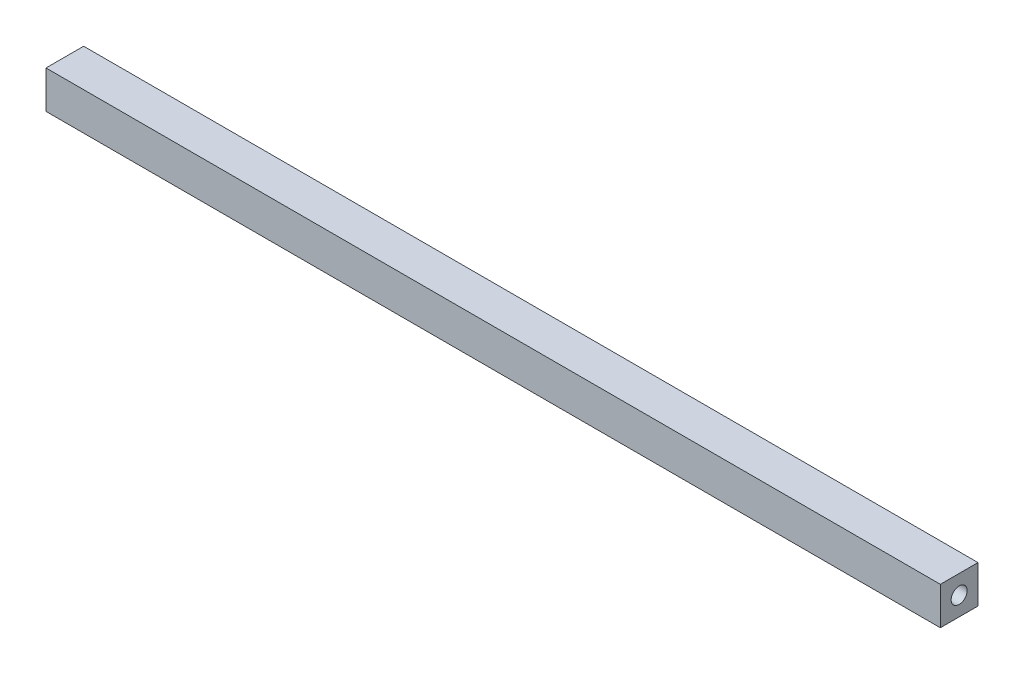
ISO-10303-21;
HEADER;
FILE_DESCRIPTION(('STEP AP214'),'2;1');
FILE_NAME('part.step','',(''),(''),'','','');
FILE_SCHEMA(('AUTOMOTIVE_DESIGN { 1 0 10303 214 1 1 1 1 }'));
ENDSEC;
DATA;
#1=APPLICATION_CONTEXT('core data for automotive mechanical design processes');
#2=APPLICATION_PROTOCOL_DEFINITION('international standard','automotive_design',2000,#1);
#3=PRODUCT_CONTEXT('',#1,'mechanical');
#4=PRODUCT('Part','Part','',(#3));
#5=PRODUCT_RELATED_PRODUCT_CATEGORY('part','',(#4));
#6=PRODUCT_DEFINITION_FORMATION('','',#4);
#7=PRODUCT_DEFINITION_CONTEXT('part definition',#1,'design');
#8=PRODUCT_DEFINITION('design','',#6,#7);
#9=PRODUCT_DEFINITION_SHAPE('','',#8);
#10=(LENGTH_UNIT() NAMED_UNIT(*) SI_UNIT(.MILLI.,.METRE.));
#11=(NAMED_UNIT(*) PLANE_ANGLE_UNIT() SI_UNIT($,.RADIAN.));
#12=(NAMED_UNIT(*) SI_UNIT($,.STERADIAN.) SOLID_ANGLE_UNIT());
#13=UNCERTAINTY_MEASURE_WITH_UNIT(LENGTH_MEASURE(1.E-05),#10,'distance_accuracy_value','');
#14=(GEOMETRIC_REPRESENTATION_CONTEXT(3) GLOBAL_UNCERTAINTY_ASSIGNED_CONTEXT((#13)) GLOBAL_UNIT_ASSIGNED_CONTEXT((#10,
#11,#12)) REPRESENTATION_CONTEXT('',''));
#15=CARTESIAN_POINT('',(0.,0.,0.));
#16=DIRECTION('',(0.,0.,1.));
#17=DIRECTION('',(1.,0.,0.));
#18=AXIS2_PLACEMENT_3D('',#15,#16,#17);
#19=CARTESIAN_POINT('',(47.5,-2.,-2.));
#20=DIRECTION('',(0.,0.,1.));
#21=DIRECTION('',(1.,0.,0.));
#22=AXIS2_PLACEMENT_3D('',#19,#20,#21);
#23=PLANE('',#22);
#24=DIRECTION('',(0.,1.,0.));
#25=VECTOR('',#24,1.);
#26=CARTESIAN_POINT('',(-47.5,-2.,-2.));
#27=LINE('',#26,#25);
#28=CARTESIAN_POINT('',(-47.5,-2.,-2.));
#29=VERTEX_POINT('',#28);
#30=CARTESIAN_POINT('',(-47.5,2.,-2.));
#31=VERTEX_POINT('',#30);
#32=EDGE_CURVE('E96',#29,#31,#27,.T.);
#33=ORIENTED_EDGE('',*,*,#32,.T.);
#34=DIRECTION('',(-1.,0.,0.));
#35=VECTOR('',#34,1.);
#36=CARTESIAN_POINT('',(47.5,2.,-2.));
#37=LINE('',#36,#35);
#38=CARTESIAN_POINT('',(47.5,2.,-2.));
#39=VERTEX_POINT('',#38);
#40=EDGE_CURVE('E11',#39,#31,#37,.T.);
#41=ORIENTED_EDGE('',*,*,#40,.F.);
#42=DIRECTION('',(0.,1.,0.));
#43=VECTOR('',#42,1.);
#44=CARTESIAN_POINT('',(47.5,-2.,-2.));
#45=LINE('',#44,#43);
#46=CARTESIAN_POINT('',(47.5,-2.,-2.));
#47=VERTEX_POINT('',#46);
#48=EDGE_CURVE('E84',#47,#39,#45,.T.);
#49=ORIENTED_EDGE('',*,*,#48,.F.);
#50=DIRECTION('',(-1.,0.,0.));
#51=VECTOR('',#50,1.);
#52=CARTESIAN_POINT('',(47.5,-2.,-2.));
#53=LINE('',#52,#51);
#54=EDGE_CURVE('E92',#47,#29,#53,.T.);
#55=ORIENTED_EDGE('',*,*,#54,.T.);
#56=EDGE_LOOP('',(#33,#41,#49,#55));
#57=FACE_BOUND('',#56,.T.);
#58=ADVANCED_FACE('F33',(#57),#23,.F.);
#59=CARTESIAN_POINT('',(47.5,2.,2.));
#60=DIRECTION('',(0.,-1.,0.));
#61=DIRECTION('',(0.,0.,-1.));
#62=AXIS2_PLACEMENT_3D('',#59,#60,#61);
#63=PLANE('',#62);
#64=DIRECTION('',(0.,0.,1.));
#65=VECTOR('',#64,1.);
#66=CARTESIAN_POINT('',(-47.5,2.,2.));
#67=LINE('',#66,#65);
#68=CARTESIAN_POINT('',(-47.5,2.,2.));
#69=VERTEX_POINT('',#68);
#70=EDGE_CURVE('E88',#31,#69,#67,.T.);
#71=ORIENTED_EDGE('',*,*,#70,.T.);
#72=DIRECTION('',(-1.,0.,0.));
#73=VECTOR('',#72,1.);
#74=CARTESIAN_POINT('',(47.5,2.,2.));
#75=LINE('',#74,#73);
#76=CARTESIAN_POINT('',(47.5,2.,2.));
#77=VERTEX_POINT('',#76);
#78=EDGE_CURVE('E41',#77,#69,#75,.T.);
#79=ORIENTED_EDGE('',*,*,#78,.F.);
#80=DIRECTION('',(0.,0.,1.));
#81=VECTOR('',#80,1.);
#82=CARTESIAN_POINT('',(47.5,2.,2.));
#83=LINE('',#82,#81);
#84=EDGE_CURVE('E79',#39,#77,#83,.T.);
#85=ORIENTED_EDGE('',*,*,#84,.F.);
#86=ORIENTED_EDGE('',*,*,#40,.T.);
#87=EDGE_LOOP('',(#71,#79,#85,#86));
#88=FACE_BOUND('',#87,.T.);
#89=ADVANCED_FACE('F87',(#88),#63,.F.);
#90=CARTESIAN_POINT('',(47.5,-2.,2.));
#91=DIRECTION('',(0.,0.,-1.));
#92=DIRECTION('',(-1.,0.,0.));
#93=AXIS2_PLACEMENT_3D('',#90,#91,#92);
#94=PLANE('',#93);
#95=DIRECTION('',(0.,-1.,0.));
#96=VECTOR('',#95,1.);
#97=CARTESIAN_POINT('',(-47.5,-2.,2.));
#98=LINE('',#97,#96);
#99=CARTESIAN_POINT('',(-47.5,-2.,2.));
#100=VERTEX_POINT('',#99);
#101=EDGE_CURVE('E66',#69,#100,#98,.T.);
#102=ORIENTED_EDGE('',*,*,#101,.T.);
#103=DIRECTION('',(-1.,0.,0.));
#104=VECTOR('',#103,1.);
#105=CARTESIAN_POINT('',(47.5,-2.,2.));
#106=LINE('',#105,#104);
#107=CARTESIAN_POINT('',(47.5,-2.,2.));
#108=VERTEX_POINT('',#107);
#109=EDGE_CURVE('E89',#108,#100,#106,.T.);
#110=ORIENTED_EDGE('',*,*,#109,.F.);
#111=DIRECTION('',(0.,-1.,0.));
#112=VECTOR('',#111,1.);
#113=CARTESIAN_POINT('',(47.5,-2.,2.));
#114=LINE('',#113,#112);
#115=EDGE_CURVE('E82',#77,#108,#114,.T.);
#116=ORIENTED_EDGE('',*,*,#115,.F.);
#117=ORIENTED_EDGE('',*,*,#78,.T.);
#118=EDGE_LOOP('',(#102,#110,#116,#117));
#119=FACE_BOUND('',#118,.T.);
#120=ADVANCED_FACE('F90',(#119),#94,.F.);
#121=CARTESIAN_POINT('',(47.5,-2.,2.));
#122=DIRECTION('',(0.,1.,0.));
#123=DIRECTION('',(0.,0.,1.));
#124=AXIS2_PLACEMENT_3D('',#121,#122,#123);
#125=PLANE('',#124);
#126=DIRECTION('',(0.,0.,-1.));
#127=VECTOR('',#126,1.);
#128=CARTESIAN_POINT('',(-47.5,-2.,2.));
#129=LINE('',#128,#127);
#130=EDGE_CURVE('E72',#100,#29,#129,.T.);
#131=ORIENTED_EDGE('',*,*,#130,.T.);
#132=ORIENTED_EDGE('',*,*,#54,.F.);
#133=DIRECTION('',(0.,0.,-1.));
#134=VECTOR('',#133,1.);
#135=CARTESIAN_POINT('',(47.5,-2.,2.));
#136=LINE('',#135,#134);
#137=EDGE_CURVE('E49',#108,#47,#136,.T.);
#138=ORIENTED_EDGE('',*,*,#137,.F.);
#139=ORIENTED_EDGE('',*,*,#109,.T.);
#140=EDGE_LOOP('',(#131,#132,#138,#139));
#141=FACE_BOUND('',#140,.T.);
#142=ADVANCED_FACE('F104',(#141),#125,.F.);
#143=CARTESIAN_POINT('',(47.5,0.,0.));
#144=DIRECTION('',(-1.,0.,0.));
#145=DIRECTION('',(0.,0.,1.));
#146=AXIS2_PLACEMENT_3D('',#143,#144,#145);
#147=PLANE('',#146);
#148=CARTESIAN_POINT('',(47.5,0.,0.));
#149=DIRECTION('',(-1.,0.,0.));
#150=DIRECTION('',(0.,0.,1.));
#151=AXIS2_PLACEMENT_3D('',#148,#149,#150);
#152=CIRCLE('',#151,0.85);
#153=CARTESIAN_POINT('',(47.5,0.,0.85));
#154=VERTEX_POINT('',#153);
#155=EDGE_CURVE('E99',#154,#154,#152,.F.);
#156=ORIENTED_EDGE('',*,*,#155,.F.);
#157=EDGE_LOOP('',(#156));
#158=FACE_BOUND('',#157,.T.);
#159=ORIENTED_EDGE('',*,*,#48,.T.);
#160=ORIENTED_EDGE('',*,*,#84,.T.);
#161=ORIENTED_EDGE('',*,*,#115,.T.);
#162=ORIENTED_EDGE('',*,*,#137,.T.);
#163=EDGE_LOOP('',(#159,#160,#161,#162));
#164=FACE_BOUND('',#163,.T.);
#165=ADVANCED_FACE('F80',(#158,#164),#147,.F.);
#166=CARTESIAN_POINT('',(-47.5,0.,0.));
#167=DIRECTION('',(-1.,0.,0.));
#168=DIRECTION('',(0.,0.,1.));
#169=AXIS2_PLACEMENT_3D('',#166,#167,#168);
#170=PLANE('',#169);
#171=CARTESIAN_POINT('',(-47.5,0.,0.));
#172=DIRECTION('',(-1.,0.,0.));
#173=DIRECTION('',(0.,0.,1.));
#174=AXIS2_PLACEMENT_3D('',#171,#172,#173);
#175=CIRCLE('',#174,0.85);
#176=CARTESIAN_POINT('',(-47.5,0.,0.85));
#177=VERTEX_POINT('',#176);
#178=EDGE_CURVE('E112',#177,#177,#175,.F.);
#179=ORIENTED_EDGE('',*,*,#178,.T.);
#180=EDGE_LOOP('',(#179));
#181=FACE_BOUND('',#180,.T.);
#182=ORIENTED_EDGE('',*,*,#32,.F.);
#183=ORIENTED_EDGE('',*,*,#130,.F.);
#184=ORIENTED_EDGE('',*,*,#101,.F.);
#185=ORIENTED_EDGE('',*,*,#70,.F.);
#186=EDGE_LOOP('',(#182,#183,#184,#185));
#187=FACE_BOUND('',#186,.T.);
#188=ADVANCED_FACE('F107',(#181,#187),#170,.T.);
#189=CARTESIAN_POINT('',(47.500012,0.,0.));
#190=DIRECTION('',(-1.,0.,0.));
#191=DIRECTION('',(0.,0.,1.));
#192=AXIS2_PLACEMENT_3D('',#189,#190,#191);
#193=CYLINDRICAL_SURFACE('',#192,0.85);
#194=CARTESIAN_POINT('',(-47.5,0.,0.85));
#195=CARTESIAN_POINT('',(-46.5104166666667,0.,0.85));
#196=CARTESIAN_POINT('',(-45.5208333333333,0.,0.85));
#197=CARTESIAN_POINT('',(-43.5416666666667,0.,0.85));
#198=CARTESIAN_POINT('',(-42.5520833333333,0.,0.85));
#199=CARTESIAN_POINT('',(-40.5729166666667,0.,0.85));
#200=CARTESIAN_POINT('',(-39.5833333333333,0.,0.85));
#201=CARTESIAN_POINT('',(-37.6041666666667,0.,0.85));
#202=CARTESIAN_POINT('',(-36.6145833333333,0.,0.85));
#203=CARTESIAN_POINT('',(-34.6354166666667,0.,0.85));
#204=CARTESIAN_POINT('',(-33.6458333333333,0.,0.85));
#205=CARTESIAN_POINT('',(-31.6666666666667,0.,0.85));
#206=CARTESIAN_POINT('',(-30.6770833333333,0.,0.85));
#207=CARTESIAN_POINT('',(-28.6979166666667,0.,0.85));
#208=CARTESIAN_POINT('',(-27.7083333333333,0.,0.85));
#209=CARTESIAN_POINT('',(-25.7291666666667,0.,0.85));
#210=CARTESIAN_POINT('',(-24.7395833333333,0.,0.85));
#211=CARTESIAN_POINT('',(-22.7604166666667,0.,0.85));
#212=CARTESIAN_POINT('',(-21.7708333333333,0.,0.85));
#213=CARTESIAN_POINT('',(-19.7916666666667,0.,0.85));
#214=CARTESIAN_POINT('',(-18.8020833333333,0.,0.85));
#215=CARTESIAN_POINT('',(-16.8229166666667,0.,0.85));
#216=CARTESIAN_POINT('',(-15.8333333333333,0.,0.85));
#217=CARTESIAN_POINT('',(-13.8541666666667,0.,0.85));
#218=CARTESIAN_POINT('',(-12.8645833333333,0.,0.85));
#219=CARTESIAN_POINT('',(-10.8854166666667,0.,0.85));
#220=CARTESIAN_POINT('',(-9.89583333333334,0.,0.85));
#221=CARTESIAN_POINT('',(-7.91666666666667,0.,0.85));
#222=CARTESIAN_POINT('',(-6.92708333333333,0.,0.85));
#223=CARTESIAN_POINT('',(-4.94791666666666,0.,0.85));
#224=CARTESIAN_POINT('',(-3.95833333333333,0.,0.85));
#225=CARTESIAN_POINT('',(-1.97916666666667,0.,0.85));
#226=CARTESIAN_POINT('',(-0.989583333333333,0.,0.85));
#227=CARTESIAN_POINT('',(0.989583333333333,0.,0.85));
#228=CARTESIAN_POINT('',(1.97916666666667,0.,0.85));
#229=CARTESIAN_POINT('',(3.95833333333333,0.,0.85));
#230=CARTESIAN_POINT('',(4.94791666666667,0.,0.85));
#231=CARTESIAN_POINT('',(6.92708333333333,0.,0.85));
#232=CARTESIAN_POINT('',(7.91666666666667,0.,0.85));
#233=CARTESIAN_POINT('',(9.89583333333334,0.,0.85));
#234=CARTESIAN_POINT('',(10.8854166666667,0.,0.85));
#235=CARTESIAN_POINT('',(12.8645833333333,0.,0.85));
#236=CARTESIAN_POINT('',(13.8541666666667,0.,0.85));
#237=CARTESIAN_POINT('',(15.8333333333333,0.,0.85));
#238=CARTESIAN_POINT('',(16.8229166666667,0.,0.85));
#239=CARTESIAN_POINT('',(18.8020833333333,0.,0.85));
#240=CARTESIAN_POINT('',(19.7916666666667,0.,0.85));
#241=CARTESIAN_POINT('',(21.7708333333333,0.,0.85));
#242=CARTESIAN_POINT('',(22.7604166666667,0.,0.85));
#243=CARTESIAN_POINT('',(24.7395833333333,0.,0.85));
#244=CARTESIAN_POINT('',(25.7291666666667,0.,0.85));
#245=CARTESIAN_POINT('',(27.7083333333333,0.,0.85));
#246=CARTESIAN_POINT('',(28.6979166666667,0.,0.85));
#247=CARTESIAN_POINT('',(30.6770833333333,0.,0.85));
#248=CARTESIAN_POINT('',(31.6666666666667,0.,0.85));
#249=CARTESIAN_POINT('',(33.6458333333333,0.,0.85));
#250=CARTESIAN_POINT('',(34.6354166666667,0.,0.85));
#251=CARTESIAN_POINT('',(36.6145833333333,0.,0.85));
#252=CARTESIAN_POINT('',(37.6041666666667,0.,0.85));
#253=CARTESIAN_POINT('',(39.5833333333333,0.,0.85));
#254=CARTESIAN_POINT('',(40.5729166666667,0.,0.85));
#255=CARTESIAN_POINT('',(42.5520833333333,0.,0.85));
#256=CARTESIAN_POINT('',(43.5416666666667,0.,0.85));
#257=CARTESIAN_POINT('',(45.5208333333333,0.,0.85));
#258=CARTESIAN_POINT('',(46.5104166666667,0.,0.85));
#259=CARTESIAN_POINT('',(47.5,0.,0.85));
#260=B_SPLINE_CURVE_WITH_KNOTS('',3,(#194,#195,#196,#197,#198,#199,#200,#201,#202,#203,#204,
#205,#206,#207,#208,#209,#210,#211,#212,#213,#214,#215,#216,#217,#218,#219,#220,#221,#222,#223,
#224,#225,#226,#227,#228,#229,#230,#231,#232,#233,#234,#235,#236,#237,#238,#239,#240,#241,#242,
#243,#244,#245,#246,#247,#248,#249,#250,#251,#252,#253,#254,#255,#256,#257,#258,#259),
.UNSPECIFIED.,.F.,.F.,(4,2,2,2,2,2,2,2,2,2,2,2,2,2,2,2,2,2,2,2,2,2,2,2,2,2,2,2,2,2,2,2,4),(0.,
2.96875000000001,5.9375,8.90625,11.875,14.84375,17.8125,20.78125,23.75,26.71875,29.6875,
32.65625,35.625,38.59375,41.5625,44.53125,47.5,50.46875,53.4375,56.40625,59.375,62.34375,
65.3125,68.28125,71.25,74.21875,77.1875,80.15625,83.125,86.09375,89.0625,92.03125,95.),.UNSPECIFIED.);
#261=EDGE_CURVE('BSEAM117',#177,#154,#260,.T.);
#262=ORIENTED_EDGE('',*,*,#178,.F.);
#263=ORIENTED_EDGE('',*,*,#155,.T.);
#264=ORIENTED_EDGE('',*,*,#261,.T.);
#265=ORIENTED_EDGE('',*,*,#261,.F.);
#266=EDGE_LOOP('',(#262,#264,#263,#265));
#267=FACE_BOUND('',#266,.T.);
#268=ADVANCED_FACE('F117',(#267),#193,.F.);
#269=CLOSED_SHELL('',(#58,#89,#120,#142,#165,#188,#268));
#270=MANIFOLD_SOLID_BREP('B2',#269);
#271=ADVANCED_BREP_SHAPE_REPRESENTATION('',(#18,#270),#14);
#272=SHAPE_DEFINITION_REPRESENTATION(#9,#271);
ENDSEC;
END-ISO-10303-21;
